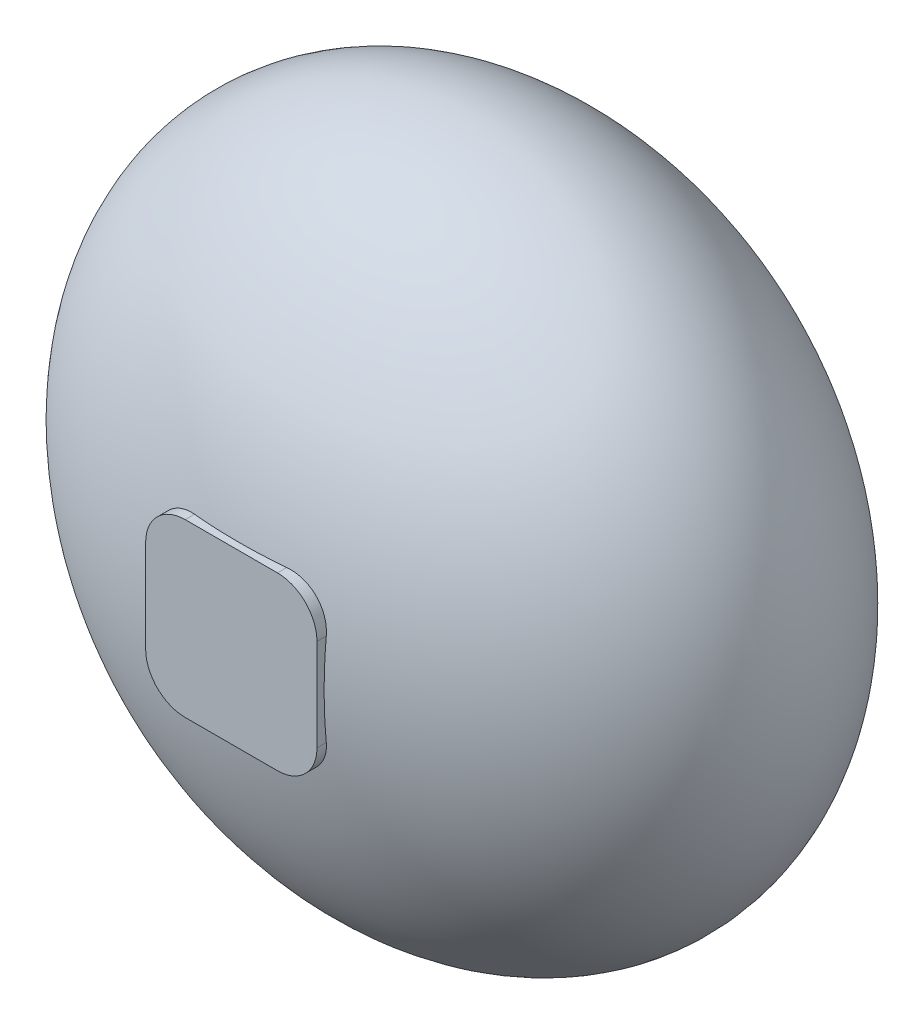
ISO-10303-21;
HEADER;
FILE_DESCRIPTION(('STEP AP214'),'2;1');
FILE_NAME('part.step','',(''),(''),'','','');
FILE_SCHEMA(('AUTOMOTIVE_DESIGN { 1 0 10303 214 1 1 1 1 }'));
ENDSEC;
DATA;
#1=APPLICATION_CONTEXT('core data for automotive mechanical design processes');
#2=APPLICATION_PROTOCOL_DEFINITION('international standard','automotive_design',2000,#1);
#3=PRODUCT_CONTEXT('',#1,'mechanical');
#4=PRODUCT('Part','Part','',(#3));
#5=PRODUCT_RELATED_PRODUCT_CATEGORY('part','',(#4));
#6=PRODUCT_DEFINITION_FORMATION('','',#4);
#7=PRODUCT_DEFINITION_CONTEXT('part definition',#1,'design');
#8=PRODUCT_DEFINITION('design','',#6,#7);
#9=PRODUCT_DEFINITION_SHAPE('','',#8);
#10=(LENGTH_UNIT() NAMED_UNIT(*) SI_UNIT(.MILLI.,.METRE.));
#11=(NAMED_UNIT(*) PLANE_ANGLE_UNIT() SI_UNIT($,.RADIAN.));
#12=(NAMED_UNIT(*) SI_UNIT($,.STERADIAN.) SOLID_ANGLE_UNIT());
#13=UNCERTAINTY_MEASURE_WITH_UNIT(LENGTH_MEASURE(1.E-05),#10,'distance_accuracy_value','');
#14=(GEOMETRIC_REPRESENTATION_CONTEXT(3) GLOBAL_UNCERTAINTY_ASSIGNED_CONTEXT((#13)) GLOBAL_UNIT_ASSIGNED_CONTEXT((#10,
#11,#12)) REPRESENTATION_CONTEXT('',''));
#15=CARTESIAN_POINT('',(0.,0.,0.));
#16=DIRECTION('',(0.,0.,1.));
#17=DIRECTION('',(1.,0.,0.));
#18=AXIS2_PLACEMENT_3D('',#15,#16,#17);
#19=CARTESIAN_POINT('',(0.,0.,0.));
#20=DIRECTION('',(0.,1.,0.));
#21=DIRECTION('',(-1.,0.,0.));
#22=AXIS2_PLACEMENT_3D('',#19,#20,#21);
#23=ELLIPSE('',#22,26.25,17.5);
#24=TRIMMED_CURVE('',#23,(PARAMETER_VALUE(1.5707963267949)),(PARAMETER_VALUE(4.71238898038469)),
.T.,.PARAMETER.);
#25=CARTESIAN_POINT('',(0.,0.,-17.5));
#26=DIRECTION('',(0.,0.,-1.));
#27=AXIS1_PLACEMENT('',#25,#26);
#28=SURFACE_OF_REVOLUTION('',#24,#27);
#29=CARTESIAN_POINT('',(0.,0.,-17.5));
#30=VERTEX_POINT('',#29);
#31=VERTEX_LOOP('',#30);
#32=FACE_BOUND('',#31,.T.);
#33=CARTESIAN_POINT('',(-6.5,6.5,16.3919017946193));
#34=CARTESIAN_POINT('',(-6.5,5.91264525642044,16.4953809386063));
#35=CARTESIAN_POINT('',(-6.5,5.32276773298897,16.5843647981933));
#36=CARTESIAN_POINT('',(-6.5,4.13942182537297,16.7337448501683));
#37=CARTESIAN_POINT('',(-6.5,3.54595357722673,16.7941421188048));
#38=CARTESIAN_POINT('',(-6.5,2.36163427938386,16.8863859319888));
#39=CARTESIAN_POINT('',(-6.5,1.77080075515783,16.9184589344479));
#40=CARTESIAN_POINT('',(-6.5,0.588282759476114,16.9550621892876));
#41=CARTESIAN_POINT('',(-6.5,-0.00340169863220947,16.9595928690712));
#42=CARTESIAN_POINT('',(-6.5,-1.08795048016656,16.9426760838968));
#43=CARTESIAN_POINT('',(-6.5,-1.58088483011511,16.9254235652404));
#44=CARTESIAN_POINT('',(-6.5,-2.56568174740475,16.8717228338387));
#45=CARTESIAN_POINT('',(-6.5,-3.05754438212753,16.8352758650471));
#46=CARTESIAN_POINT('',(-6.5,-4.04278596473044,16.7427283208595));
#47=CARTESIAN_POINT('',(-6.5,-4.53615258913905,16.6864961919658));
#48=CARTESIAN_POINT('',(-6.5,-5.52026473693784,16.5541647888713));
#49=CARTESIAN_POINT('',(-6.5,-6.01100997822129,16.478063418662));
#50=CARTESIAN_POINT('',(-6.5,-6.5,16.3919017946193));
#51=B_SPLINE_CURVE_WITH_KNOTS('',3,(#33,#34,#35,#36,#37,#38,#39,#40,#41,#42,#43,#44,#45,#46,#47,
#48,#49,#50),.UNSPECIFIED.,.F.,.F.,(4,2,2,2,2,2,2,2,4),(0.,1.78897640576976,3.57788545351683,
5.35235885285136,7.12680471576133,8.60615443752241,10.0854082974045,11.574689757719,
13.0641283860143),.UNSPECIFIED.);
#52=CARTESIAN_POINT('',(-6.49999999999999,3.50000000000234,16.7936826746777));
#53=VERTEX_POINT('',#52);
#54=CARTESIAN_POINT('',(-6.5,-3.50000000000202,16.7936826746777));
#55=VERTEX_POINT('',#54);
#56=EDGE_CURVE('E209',#53,#55,#51,.T.);
#57=ORIENTED_EDGE('',*,*,#56,.F.);
#58=CARTESIAN_POINT('',(-6.50000000000002,3.50000000000001,16.7936826746778));
#59=CARTESIAN_POINT('',(-6.50000800540084,3.58386339966856,16.7859138861007));
#60=CARTESIAN_POINT('',(-6.49648345602694,3.66775391431981,16.778464398223));
#61=CARTESIAN_POINT('',(-6.4824157644123,3.83500259933564,16.7642567511762));
#62=CARTESIAN_POINT('',(-6.47187267822471,3.91836077394636,16.7574985864864));
#63=CARTESIAN_POINT('',(-6.44382172405599,4.0839165036294,16.7447295084521));
#64=CARTESIAN_POINT('',(-6.42631748091182,4.16611463972995,16.7387182083326));
#65=CARTESIAN_POINT('',(-6.3844729513372,4.32878152790409,16.7274862214383));
#66=CARTESIAN_POINT('',(-6.3601328239601,4.40925032016815,16.7222655162728));
#67=CARTESIAN_POINT('',(-6.27702490092959,4.64731347488568,16.7078470081295));
#68=CARTESIAN_POINT('',(-6.20816368683197,4.80159918870719,16.6998901457319));
#69=CARTESIAN_POINT('',(-6.04553925582569,5.0964355541159,16.6875703906421));
#70=CARTESIAN_POINT('',(-5.95178274437025,5.2369898902732,16.6832065314841));
#71=CARTESIAN_POINT('',(-5.74248981911255,5.49982772547607,16.6782132190706));
#72=CARTESIAN_POINT('',(-5.62705922502828,5.62219502632319,16.6775660851574));
#73=CARTESIAN_POINT('',(-5.37739699713493,5.84595116267732,16.6799822276552));
#74=CARTESIAN_POINT('',(-5.24316221398295,5.94733647704101,16.6830461262519));
#75=CARTESIAN_POINT('',(-4.96005489368249,6.12606477229132,16.6927757479706));
#76=CARTESIAN_POINT('',(-4.8112121797322,6.20345544904981,16.6994342526275));
#77=CARTESIAN_POINT('',(-4.50290923054941,6.33232291752021,16.7161403139002));
#78=CARTESIAN_POINT('',(-4.3434538123607,6.38381137648715,16.7261863412466));
#79=CARTESIAN_POINT('',(-4.06930985491151,6.44772262850331,16.7457246870422));
#80=CARTESIAN_POINT('',(-3.95618128905426,6.46732247660949,16.7544112980895));
#81=CARTESIAN_POINT('',(-3.72869707686171,6.49346116193029,16.7730947027936));
#82=CARTESIAN_POINT('',(-3.61434341928388,6.50001865891717,16.7830896028053));
#83=CARTESIAN_POINT('',(-3.49999999999984,6.5,16.7936826746779));
#84=B_SPLINE_CURVE_WITH_KNOTS('',3,(#58,#59,#60,#61,#62,#63,#64,#65,#66,#67,#68,#69,#70,#71,#72,
#73,#74,#75,#76,#77,#78,#79,#80,#81,#82,#83),.UNSPECIFIED.,.F.,.F.,(4,2,2,2,2,2,2,2,2,2,2,2,4),
(0.,0.252588171974242,0.505174326691704,0.757629125761421,1.01007805134753,1.51487172308837,
2.01952956825821,2.52178472824085,3.02412410717383,3.52545845145075,4.02656677474797,
4.37128160165595,4.71550288714436),.UNSPECIFIED.);
#85=CARTESIAN_POINT('',(-3.50000000000203,6.5,16.7936826746777));
#86=VERTEX_POINT('',#85);
#87=EDGE_CURVE('E62',#53,#86,#84,.T.);
#88=ORIENTED_EDGE('',*,*,#87,.T.);
#89=CARTESIAN_POINT('',(6.5,6.5,16.3919017946193));
#90=CARTESIAN_POINT('',(5.91264525642045,6.5,16.4953809386063));
#91=CARTESIAN_POINT('',(5.32276773298898,6.5,16.5843647981933));
#92=CARTESIAN_POINT('',(4.13942182537297,6.5,16.7337448501683));
#93=CARTESIAN_POINT('',(3.54595357722673,6.5,16.7941421188048));
#94=CARTESIAN_POINT('',(2.36163427938387,6.5,16.8863859319888));
#95=CARTESIAN_POINT('',(1.77080075515783,6.5,16.9184589344479));
#96=CARTESIAN_POINT('',(0.588282759476118,6.5,16.9550621892876));
#97=CARTESIAN_POINT('',(-0.00340169863220514,6.5,16.9595928690712));
#98=CARTESIAN_POINT('',(-1.08795048016656,6.5,16.9426760838968));
#99=CARTESIAN_POINT('',(-1.5808848301151,6.5,16.9254235652404));
#100=CARTESIAN_POINT('',(-2.56568174740475,6.5,16.8717228338387));
#101=CARTESIAN_POINT('',(-3.05754438212753,6.5,16.8352758650471));
#102=CARTESIAN_POINT('',(-4.04278596473044,6.5,16.7427283208595));
#103=CARTESIAN_POINT('',(-4.53615258913904,6.5,16.6864961919659));
#104=CARTESIAN_POINT('',(-5.52026473693783,6.5,16.5541647888713));
#105=CARTESIAN_POINT('',(-6.01100997822129,6.5,16.478063418662));
#106=CARTESIAN_POINT('',(-6.5,6.5,16.3919017946193));
#107=B_SPLINE_CURVE_WITH_KNOTS('',3,(#89,#90,#91,#92,#93,#94,#95,#96,#97,#98,#99,#100,#101,#102,
#103,#104,#105,#106),.UNSPECIFIED.,.F.,.F.,(4,2,2,2,2,2,2,2,4),(0.,1.78897640576976,
3.57788545351683,5.35235885285136,7.12680471576132,8.60615443752241,10.0854082974045,
11.574689757719,13.0641283860143),.UNSPECIFIED.);
#108=CARTESIAN_POINT('',(3.50000000000234,6.50000000000001,16.7936826746777));
#109=VERTEX_POINT('',#108);
#110=EDGE_CURVE('E200',#109,#86,#107,.T.);
#111=ORIENTED_EDGE('',*,*,#110,.F.);
#112=CARTESIAN_POINT('',(3.50000000000001,6.50000000000002,16.7936826746778));
#113=CARTESIAN_POINT('',(3.58386339966856,6.50000800540084,16.7859138861007));
#114=CARTESIAN_POINT('',(3.66775391431981,6.49648345602694,16.778464398223));
#115=CARTESIAN_POINT('',(3.83500259933564,6.4824157644123,16.7642567511762));
#116=CARTESIAN_POINT('',(3.91836077394636,6.47187267822471,16.7574985864864));
#117=CARTESIAN_POINT('',(4.0839165036294,6.44382172405599,16.7447295084521));
#118=CARTESIAN_POINT('',(4.16611463972995,6.42631748091182,16.7387182083326));
#119=CARTESIAN_POINT('',(4.32878152790409,6.3844729513372,16.7274862214383));
#120=CARTESIAN_POINT('',(4.40925032016815,6.36013282396011,16.7222655162728));
#121=CARTESIAN_POINT('',(4.64731347488568,6.27702490092959,16.7078470081295));
#122=CARTESIAN_POINT('',(4.80159918870719,6.20816368683198,16.6998901457319));
#123=CARTESIAN_POINT('',(5.09643555411589,6.0455392558257,16.6875703906421));
#124=CARTESIAN_POINT('',(5.2369898902732,5.95178274437025,16.6832065314841));
#125=CARTESIAN_POINT('',(5.49982772547606,5.74248981911255,16.6782132190706));
#126=CARTESIAN_POINT('',(5.62219502632319,5.62705922502828,16.6775660851574));
#127=CARTESIAN_POINT('',(5.84595116267732,5.37739699713493,16.6799822276552));
#128=CARTESIAN_POINT('',(5.94733647704101,5.24316221398295,16.6830461262519));
#129=CARTESIAN_POINT('',(6.12606477229131,4.96005489368249,16.6927757479706));
#130=CARTESIAN_POINT('',(6.20345544904981,4.8112121797322,16.6994342526275));
#131=CARTESIAN_POINT('',(6.33232291752021,4.50290923054942,16.7161403139002));
#132=CARTESIAN_POINT('',(6.38381137648715,4.34345381236071,16.7261863412466));
#133=CARTESIAN_POINT('',(6.44772262850331,4.06930985491152,16.7457246870422));
#134=CARTESIAN_POINT('',(6.46732247660949,3.95618128905427,16.7544112980895));
#135=CARTESIAN_POINT('',(6.49346116193028,3.72869707686171,16.7730947027936));
#136=CARTESIAN_POINT('',(6.50001865891717,3.61434341928388,16.7830896028053));
#137=CARTESIAN_POINT('',(6.5,3.49999999999984,16.7936826746779));
#138=B_SPLINE_CURVE_WITH_KNOTS('',3,(#112,#113,#114,#115,#116,#117,#118,#119,#120,#121,#122,
#123,#124,#125,#126,#127,#128,#129,#130,#131,#132,#133,#134,#135,#136,#137),.UNSPECIFIED.,.F.,
.F.,(4,2,2,2,2,2,2,2,2,2,2,2,4),(0.,0.252588171974242,0.505174326691704,0.75762912576142,
1.01007805134753,1.51487172308837,2.01952956825821,2.52178472824086,3.02412410717383,
3.52545845145075,4.02656677474797,4.37128160165595,4.71550288714436),.UNSPECIFIED.);
#139=CARTESIAN_POINT('',(6.5,3.50000000000202,16.7936826746777));
#140=VERTEX_POINT('',#139);
#141=EDGE_CURVE('E55',#109,#140,#138,.T.);
#142=ORIENTED_EDGE('',*,*,#141,.T.);
#143=CARTESIAN_POINT('',(6.5,-6.5,16.3919017946193));
#144=CARTESIAN_POINT('',(6.5,-5.91264525642044,16.4953809386063));
#145=CARTESIAN_POINT('',(6.5,-5.32276773298897,16.5843647981933));
#146=CARTESIAN_POINT('',(6.5,-4.13942182537297,16.7337448501683));
#147=CARTESIAN_POINT('',(6.5,-3.54595357722673,16.7941421188048));
#148=CARTESIAN_POINT('',(6.5,-2.36163427938386,16.8863859319888));
#149=CARTESIAN_POINT('',(6.5,-1.77080075515783,16.9184589344479));
#150=CARTESIAN_POINT('',(6.5,-0.588282759476115,16.9550621892876));
#151=CARTESIAN_POINT('',(6.5,0.00340169863220861,16.9595928690712));
#152=CARTESIAN_POINT('',(6.5,1.08795048016656,16.9426760838968));
#153=CARTESIAN_POINT('',(6.5,1.58088483011511,16.9254235652404));
#154=CARTESIAN_POINT('',(6.5,2.56568174740476,16.8717228338387));
#155=CARTESIAN_POINT('',(6.5,3.05754438212753,16.8352758650471));
#156=CARTESIAN_POINT('',(6.5,4.04278596473044,16.7427283208595));
#157=CARTESIAN_POINT('',(6.5,4.53615258913905,16.6864961919658));
#158=CARTESIAN_POINT('',(6.5,5.52026473693784,16.5541647888713));
#159=CARTESIAN_POINT('',(6.5,6.0110099782213,16.478063418662));
#160=CARTESIAN_POINT('',(6.5,6.50000000000001,16.3919017946193));
#161=B_SPLINE_CURVE_WITH_KNOTS('',3,(#143,#144,#145,#146,#147,#148,#149,#150,#151,#152,#153,
#154,#155,#156,#157,#158,#159,#160),.UNSPECIFIED.,.F.,.F.,(4,2,2,2,2,2,2,2,4),(0.,
1.78897640576976,3.57788545351683,5.35235885285136,7.12680471576132,8.60615443752241,
10.0854082974045,11.574689757719,13.0641283860143),.UNSPECIFIED.);
#162=CARTESIAN_POINT('',(6.5,-3.50000000000233,16.7936826746777));
#163=VERTEX_POINT('',#162);
#164=EDGE_CURVE('E199',#163,#140,#161,.T.);
#165=ORIENTED_EDGE('',*,*,#164,.F.);
#166=CARTESIAN_POINT('',(6.50000000000002,-3.50000000000001,16.7936826746778));
#167=CARTESIAN_POINT('',(6.50000800540084,-3.58386339966855,16.7859138861007));
#168=CARTESIAN_POINT('',(6.49648345602694,-3.6677539143198,16.778464398223));
#169=CARTESIAN_POINT('',(6.4824157644123,-3.83500259933564,16.7642567511762));
#170=CARTESIAN_POINT('',(6.47187267822471,-3.91836077394636,16.7574985864864));
#171=CARTESIAN_POINT('',(6.44382172405599,-4.0839165036294,16.7447295084521));
#172=CARTESIAN_POINT('',(6.42631748091182,-4.16611463972995,16.7387182083326));
#173=CARTESIAN_POINT('',(6.3844729513372,-4.32878152790409,16.7274862214383));
#174=CARTESIAN_POINT('',(6.3601328239601,-4.40925032016815,16.7222655162728));
#175=CARTESIAN_POINT('',(6.27702490092959,-4.64731347488568,16.7078470081295));
#176=CARTESIAN_POINT('',(6.20816368683197,-4.80159918870719,16.6998901457319));
#177=CARTESIAN_POINT('',(6.04553925582569,-5.09643555411589,16.6875703906421));
#178=CARTESIAN_POINT('',(5.95178274437024,-5.2369898902732,16.6832065314841));
#179=CARTESIAN_POINT('',(5.74248981911255,-5.49982772547607,16.6782132190706));
#180=CARTESIAN_POINT('',(5.62705922502827,-5.62219502632319,16.6775660851574));
#181=CARTESIAN_POINT('',(5.37739699713492,-5.84595116267732,16.6799822276552));
#182=CARTESIAN_POINT('',(5.24316221398294,-5.94733647704101,16.6830461262519));
#183=CARTESIAN_POINT('',(4.96005489368249,-6.12606477229131,16.6927757479706));
#184=CARTESIAN_POINT('',(4.8112121797322,-6.20345544904981,16.6994342526275));
#185=CARTESIAN_POINT('',(4.50290923054941,-6.33232291752021,16.7161403139002));
#186=CARTESIAN_POINT('',(4.3434538123607,-6.38381137648715,16.7261863412466));
#187=CARTESIAN_POINT('',(4.06930985491151,-6.4477226285033,16.7457246870422));
#188=CARTESIAN_POINT('',(3.95618128905426,-6.46732247660949,16.7544112980895));
#189=CARTESIAN_POINT('',(3.7286970768617,-6.49346116193028,16.7730947027936));
#190=CARTESIAN_POINT('',(3.61434341928388,-6.50001865891716,16.7830896028053));
#191=CARTESIAN_POINT('',(3.49999999999984,-6.5,16.7936826746779));
#192=B_SPLINE_CURVE_WITH_KNOTS('',3,(#166,#167,#168,#169,#170,#171,#172,#173,#174,#175,#176,
#177,#178,#179,#180,#181,#182,#183,#184,#185,#186,#187,#188,#189,#190,#191),.UNSPECIFIED.,.F.,
.F.,(4,2,2,2,2,2,2,2,2,2,2,2,4),(0.,0.252588171974243,0.505174326691706,0.757629125761424,
1.01007805134753,1.51487172308838,2.01952956825822,2.52178472824086,3.02412410717383,
3.52545845145075,4.02656677474797,4.37128160165595,4.71550288714436),.UNSPECIFIED.);
#193=CARTESIAN_POINT('',(3.50000000000202,-6.5,16.7936826746777));
#194=VERTEX_POINT('',#193);
#195=EDGE_CURVE('E166',#163,#194,#192,.T.);
#196=ORIENTED_EDGE('',*,*,#195,.T.);
#197=CARTESIAN_POINT('',(-6.5,-6.5,16.3919017946193));
#198=CARTESIAN_POINT('',(-5.91264525642045,-6.5,16.4953809386063));
#199=CARTESIAN_POINT('',(-5.32276773298897,-6.5,16.5843647981933));
#200=CARTESIAN_POINT('',(-4.13942182537297,-6.5,16.7337448501683));
#201=CARTESIAN_POINT('',(-3.54595357722673,-6.5,16.7941421188048));
#202=CARTESIAN_POINT('',(-2.36163427938387,-6.5,16.8863859319888));
#203=CARTESIAN_POINT('',(-1.77080075515783,-6.5,16.9184589344479));
#204=CARTESIAN_POINT('',(-0.588282759476118,-6.5,16.9550621892876));
#205=CARTESIAN_POINT('',(0.00340169863220535,-6.5,16.9595928690712));
#206=CARTESIAN_POINT('',(1.08795048016656,-6.5,16.9426760838968));
#207=CARTESIAN_POINT('',(1.5808848301151,-6.5,16.9254235652404));
#208=CARTESIAN_POINT('',(2.56568174740475,-6.5,16.8717228338387));
#209=CARTESIAN_POINT('',(3.05754438212753,-6.5,16.8352758650471));
#210=CARTESIAN_POINT('',(4.04278596473044,-6.5,16.7427283208595));
#211=CARTESIAN_POINT('',(4.53615258913905,-6.5,16.6864961919658));
#212=CARTESIAN_POINT('',(5.52026473693784,-6.5,16.5541647888713));
#213=CARTESIAN_POINT('',(6.0110099782213,-6.5,16.478063418662));
#214=CARTESIAN_POINT('',(6.5,-6.5,16.3919017946193));
#215=B_SPLINE_CURVE_WITH_KNOTS('',3,(#197,#198,#199,#200,#201,#202,#203,#204,#205,#206,#207,
#208,#209,#210,#211,#212,#213,#214),.UNSPECIFIED.,.F.,.F.,(4,2,2,2,2,2,2,2,4),(0.,
1.78897640576976,3.57788545351683,5.35235885285136,7.12680471576132,8.60615443752241,
10.0854082974045,11.574689757719,13.0641283860143),.UNSPECIFIED.);
#216=CARTESIAN_POINT('',(-3.50000000000234,-6.49999999999999,16.7936826746777));
#217=VERTEX_POINT('',#216);
#218=EDGE_CURVE('E205',#217,#194,#215,.T.);
#219=ORIENTED_EDGE('',*,*,#218,.F.);
#220=CARTESIAN_POINT('',(-3.50000000000001,-6.50000000000002,16.7936826746778));
#221=CARTESIAN_POINT('',(-3.58386339966855,-6.50000800540084,16.7859138861007));
#222=CARTESIAN_POINT('',(-3.66775391431981,-6.49648345602694,16.778464398223));
#223=CARTESIAN_POINT('',(-3.83500259933564,-6.4824157644123,16.7642567511762));
#224=CARTESIAN_POINT('',(-3.91836077394636,-6.47187267822471,16.7574985864864));
#225=CARTESIAN_POINT('',(-4.0839165036294,-6.44382172405599,16.7447295084521));
#226=CARTESIAN_POINT('',(-4.16611463972995,-6.42631748091181,16.7387182083326));
#227=CARTESIAN_POINT('',(-4.32878152790409,-6.3844729513372,16.7274862214383));
#228=CARTESIAN_POINT('',(-4.40925032016815,-6.3601328239601,16.7222655162728));
#229=CARTESIAN_POINT('',(-4.64731347488568,-6.27702490092959,16.7078470081295));
#230=CARTESIAN_POINT('',(-4.80159918870719,-6.20816368683197,16.6998901457319));
#231=CARTESIAN_POINT('',(-5.09643555411589,-6.04553925582569,16.6875703906421));
#232=CARTESIAN_POINT('',(-5.2369898902732,-5.95178274437024,16.6832065314841));
#233=CARTESIAN_POINT('',(-5.49982772547606,-5.74248981911255,16.6782132190706));
#234=CARTESIAN_POINT('',(-5.62219502632319,-5.62705922502827,16.6775660851574));
#235=CARTESIAN_POINT('',(-5.84595116267732,-5.37739699713492,16.6799822276552));
#236=CARTESIAN_POINT('',(-5.94733647704101,-5.24316221398295,16.6830461262519));
#237=CARTESIAN_POINT('',(-6.12606477229132,-4.9600548936825,16.6927757479706));
#238=CARTESIAN_POINT('',(-6.20345544904981,-4.8112121797322,16.6994342526275));
#239=CARTESIAN_POINT('',(-6.33232291752021,-4.50290923054941,16.7161403139002));
#240=CARTESIAN_POINT('',(-6.38381137648715,-4.34345381236071,16.7261863412466));
#241=CARTESIAN_POINT('',(-6.4477226285033,-4.06930985491151,16.7457246870423));
#242=CARTESIAN_POINT('',(-6.46732247660949,-3.95618128905426,16.7544112980895));
#243=CARTESIAN_POINT('',(-6.49346116193029,-3.7286970768617,16.7730947027936));
#244=CARTESIAN_POINT('',(-6.50001865891717,-3.61434341928388,16.7830896028053));
#245=CARTESIAN_POINT('',(-6.5,-3.49999999999983,16.7936826746779));
#246=B_SPLINE_CURVE_WITH_KNOTS('',3,(#220,#221,#222,#223,#224,#225,#226,#227,#228,#229,#230,
#231,#232,#233,#234,#235,#236,#237,#238,#239,#240,#241,#242,#243,#244,#245),.UNSPECIFIED.,.F.,
.F.,(4,2,2,2,2,2,2,2,2,2,2,2,4),(0.,0.252588171974243,0.505174326691705,0.757629125761422,
1.01007805134753,1.51487172308837,2.01952956825821,2.52178472824085,3.02412410717383,
3.52545845145075,4.02656677474796,4.37128160165595,4.71550288714436),.UNSPECIFIED.);
#247=EDGE_CURVE('E11',#217,#55,#246,.T.);
#248=ORIENTED_EDGE('',*,*,#247,.T.);
#249=EDGE_LOOP('',(#57,#88,#111,#142,#165,#196,#219,#248));
#250=FACE_BOUND('',#249,.T.);
#251=ADVANCED_FACE('F40',(#32,#250),#28,.T.);
#252=CARTESIAN_POINT('',(-6.5,-6.5,17.5));
#253=DIRECTION('',(1.,0.,0.));
#254=DIRECTION('',(0.,0.,-1.));
#255=AXIS2_PLACEMENT_3D('',#252,#253,#254);
#256=PLANE('',#255);
#257=DIRECTION('',(0.,-1.,0.));
#258=VECTOR('',#257,1.);
#259=CARTESIAN_POINT('',(-6.5,-6.5,17.5));
#260=LINE('',#259,#258);
#261=CARTESIAN_POINT('',(-6.5,3.5,17.5));
#262=VERTEX_POINT('',#261);
#263=CARTESIAN_POINT('',(-6.5,-3.5,17.5));
#264=VERTEX_POINT('',#263);
#265=EDGE_CURVE('E137',#262,#264,#260,.T.);
#266=ORIENTED_EDGE('',*,*,#265,.F.);
#267=DIRECTION('',(0.,0.,-1.));
#268=VECTOR('',#267,1.);
#269=CARTESIAN_POINT('',(-6.5,3.5,17.5));
#270=LINE('',#269,#268);
#271=EDGE_CURVE('E151',#262,#53,#270,.T.);
#272=ORIENTED_EDGE('',*,*,#271,.T.);
#273=ORIENTED_EDGE('',*,*,#56,.T.);
#274=DIRECTION('',(0.,0.,-1.));
#275=VECTOR('',#274,1.);
#276=CARTESIAN_POINT('',(-6.5,-3.5,17.5));
#277=LINE('',#276,#275);
#278=EDGE_CURVE('E146',#55,#264,#277,.F.);
#279=ORIENTED_EDGE('',*,*,#278,.T.);
#280=EDGE_LOOP('',(#266,#272,#273,#279));
#281=FACE_BOUND('',#280,.T.);
#282=ADVANCED_FACE('F261',(#281),#256,.F.);
#283=CARTESIAN_POINT('',(6.5,-6.5,17.5));
#284=DIRECTION('',(0.,1.,0.));
#285=DIRECTION('',(-1.,0.,0.));
#286=AXIS2_PLACEMENT_3D('',#283,#284,#285);
#287=PLANE('',#286);
#288=ORIENTED_EDGE('',*,*,#218,.T.);
#289=DIRECTION('',(0.,0.,-1.));
#290=VECTOR('',#289,1.);
#291=CARTESIAN_POINT('',(3.5,-6.5,17.5));
#292=LINE('',#291,#290);
#293=CARTESIAN_POINT('',(3.5,-6.5,17.5));
#294=VERTEX_POINT('',#293);
#295=EDGE_CURVE('E142',#194,#294,#292,.F.);
#296=ORIENTED_EDGE('',*,*,#295,.T.);
#297=DIRECTION('',(1.,0.,0.));
#298=VECTOR('',#297,1.);
#299=CARTESIAN_POINT('',(6.5,-6.5,17.5));
#300=LINE('',#299,#298);
#301=CARTESIAN_POINT('',(-3.5,-6.5,17.5));
#302=VERTEX_POINT('',#301);
#303=EDGE_CURVE('E124',#302,#294,#300,.T.);
#304=ORIENTED_EDGE('',*,*,#303,.F.);
#305=DIRECTION('',(0.,0.,-1.));
#306=VECTOR('',#305,1.);
#307=CARTESIAN_POINT('',(-3.5,-6.5,17.5));
#308=LINE('',#307,#306);
#309=EDGE_CURVE('E213',#302,#217,#308,.T.);
#310=ORIENTED_EDGE('',*,*,#309,.T.);
#311=EDGE_LOOP('',(#288,#296,#304,#310));
#312=FACE_BOUND('',#311,.T.);
#313=ADVANCED_FACE('F258',(#312),#287,.F.);
#314=CARTESIAN_POINT('',(6.5,-6.5,17.5));
#315=DIRECTION('',(-1.,0.,0.));
#316=DIRECTION('',(0.,0.,1.));
#317=AXIS2_PLACEMENT_3D('',#314,#315,#316);
#318=PLANE('',#317);
#319=DIRECTION('',(0.,1.,0.));
#320=VECTOR('',#319,1.);
#321=CARTESIAN_POINT('',(6.5,-6.5,17.5));
#322=LINE('',#321,#320);
#323=CARTESIAN_POINT('',(6.5,-3.5,17.5));
#324=VERTEX_POINT('',#323);
#325=CARTESIAN_POINT('',(6.5,3.5,17.5));
#326=VERTEX_POINT('',#325);
#327=EDGE_CURVE('E136',#324,#326,#322,.T.);
#328=ORIENTED_EDGE('',*,*,#327,.F.);
#329=DIRECTION('',(0.,0.,-1.));
#330=VECTOR('',#329,1.);
#331=CARTESIAN_POINT('',(6.5,-3.5,17.5));
#332=LINE('',#331,#330);
#333=EDGE_CURVE('E144',#324,#163,#332,.T.);
#334=ORIENTED_EDGE('',*,*,#333,.T.);
#335=ORIENTED_EDGE('',*,*,#164,.T.);
#336=DIRECTION('',(0.,0.,-1.));
#337=VECTOR('',#336,1.);
#338=CARTESIAN_POINT('',(6.5,3.5,17.5));
#339=LINE('',#338,#337);
#340=EDGE_CURVE('E203',#140,#326,#339,.F.);
#341=ORIENTED_EDGE('',*,*,#340,.T.);
#342=EDGE_LOOP('',(#328,#334,#335,#341));
#343=FACE_BOUND('',#342,.T.);
#344=ADVANCED_FACE('F202',(#343),#318,.F.);
#345=CARTESIAN_POINT('',(6.5,6.5,17.5));
#346=DIRECTION('',(0.,-1.,0.));
#347=DIRECTION('',(1.,0.,0.));
#348=AXIS2_PLACEMENT_3D('',#345,#346,#347);
#349=PLANE('',#348);
#350=ORIENTED_EDGE('',*,*,#110,.T.);
#351=DIRECTION('',(0.,0.,-1.));
#352=VECTOR('',#351,1.);
#353=CARTESIAN_POINT('',(-3.5,6.5,17.5));
#354=LINE('',#353,#352);
#355=CARTESIAN_POINT('',(-3.5,6.5,17.5));
#356=VERTEX_POINT('',#355);
#357=EDGE_CURVE('E163',#86,#356,#354,.F.);
#358=ORIENTED_EDGE('',*,*,#357,.T.);
#359=DIRECTION('',(-1.,0.,0.));
#360=VECTOR('',#359,1.);
#361=CARTESIAN_POINT('',(6.5,6.5,17.5));
#362=LINE('',#361,#360);
#363=CARTESIAN_POINT('',(3.5,6.5,17.5));
#364=VERTEX_POINT('',#363);
#365=EDGE_CURVE('E231',#364,#356,#362,.T.);
#366=ORIENTED_EDGE('',*,*,#365,.F.);
#367=DIRECTION('',(0.,0.,-1.));
#368=VECTOR('',#367,1.);
#369=CARTESIAN_POINT('',(3.5,6.5,17.5));
#370=LINE('',#369,#368);
#371=EDGE_CURVE('E160',#364,#109,#370,.T.);
#372=ORIENTED_EDGE('',*,*,#371,.T.);
#373=EDGE_LOOP('',(#350,#358,#366,#372));
#374=FACE_BOUND('',#373,.T.);
#375=ADVANCED_FACE('F120',(#374),#349,.F.);
#376=CARTESIAN_POINT('',(0.,0.,17.5));
#377=DIRECTION('',(0.,0.,1.));
#378=DIRECTION('',(1.,0.,0.));
#379=AXIS2_PLACEMENT_3D('',#376,#377,#378);
#380=PLANE('',#379);
#381=CARTESIAN_POINT('',(0.,0.,17.5));
#382=VERTEX_POINT('',#381);
#383=VERTEX_LOOP('',#382);
#384=FACE_BOUND('',#383,.T.);
#385=ORIENTED_EDGE('',*,*,#303,.T.);
#386=CARTESIAN_POINT('',(3.5,-3.5,17.5));
#387=DIRECTION('',(0.,0.,1.));
#388=DIRECTION('',(1.,0.,0.));
#389=AXIS2_PLACEMENT_3D('',#386,#387,#388);
#390=CIRCLE('',#389,3.);
#391=EDGE_CURVE('E127',#294,#324,#390,.T.);
#392=ORIENTED_EDGE('',*,*,#391,.T.);
#393=ORIENTED_EDGE('',*,*,#327,.T.);
#394=CARTESIAN_POINT('',(3.5,3.5,17.5));
#395=DIRECTION('',(0.,0.,1.));
#396=DIRECTION('',(1.,0.,0.));
#397=AXIS2_PLACEMENT_3D('',#394,#395,#396);
#398=CIRCLE('',#397,3.);
#399=EDGE_CURVE('E153',#326,#364,#398,.T.);
#400=ORIENTED_EDGE('',*,*,#399,.T.);
#401=ORIENTED_EDGE('',*,*,#365,.T.);
#402=CARTESIAN_POINT('',(-3.5,3.5,17.5));
#403=DIRECTION('',(0.,0.,1.));
#404=DIRECTION('',(1.,0.,0.));
#405=AXIS2_PLACEMENT_3D('',#402,#403,#404);
#406=CIRCLE('',#405,3.);
#407=EDGE_CURVE('E147',#356,#262,#406,.T.);
#408=ORIENTED_EDGE('',*,*,#407,.T.);
#409=ORIENTED_EDGE('',*,*,#265,.T.);
#410=CARTESIAN_POINT('',(-3.5,-3.5,17.5));
#411=DIRECTION('',(0.,0.,1.));
#412=DIRECTION('',(1.,0.,0.));
#413=AXIS2_PLACEMENT_3D('',#410,#411,#412);
#414=CIRCLE('',#413,3.);
#415=EDGE_CURVE('E131',#264,#302,#414,.T.);
#416=ORIENTED_EDGE('',*,*,#415,.T.);
#417=EDGE_LOOP('',(#385,#392,#393,#400,#401,#408,#409,#416));
#418=FACE_BOUND('',#417,.T.);
#419=ADVANCED_FACE('F116',(#384,#418),#380,.T.);
#420=CARTESIAN_POINT('',(3.5,-3.5,17.5));
#421=DIRECTION('',(0.,0.,-1.));
#422=DIRECTION('',(-1.,0.,0.));
#423=AXIS2_PLACEMENT_3D('',#420,#421,#422);
#424=CYLINDRICAL_SURFACE('',#423,3.);
#425=ORIENTED_EDGE('',*,*,#391,.F.);
#426=ORIENTED_EDGE('',*,*,#295,.F.);
#427=ORIENTED_EDGE('',*,*,#195,.F.);
#428=ORIENTED_EDGE('',*,*,#333,.F.);
#429=EDGE_LOOP('',(#425,#426,#427,#428));
#430=FACE_BOUND('',#429,.T.);
#431=ADVANCED_FACE('F119',(#430),#424,.T.);
#432=CARTESIAN_POINT('',(-3.5,3.5,17.5));
#433=DIRECTION('',(0.,0.,-1.));
#434=DIRECTION('',(-1.,0.,0.));
#435=AXIS2_PLACEMENT_3D('',#432,#433,#434);
#436=CYLINDRICAL_SURFACE('',#435,3.);
#437=ORIENTED_EDGE('',*,*,#407,.F.);
#438=ORIENTED_EDGE('',*,*,#357,.F.);
#439=ORIENTED_EDGE('',*,*,#87,.F.);
#440=ORIENTED_EDGE('',*,*,#271,.F.);
#441=EDGE_LOOP('',(#437,#438,#439,#440));
#442=FACE_BOUND('',#441,.T.);
#443=ADVANCED_FACE('F184',(#442),#436,.T.);
#444=CARTESIAN_POINT('',(3.5,3.5,17.5));
#445=DIRECTION('',(0.,0.,-1.));
#446=DIRECTION('',(-1.,0.,0.));
#447=AXIS2_PLACEMENT_3D('',#444,#445,#446);
#448=CYLINDRICAL_SURFACE('',#447,3.);
#449=ORIENTED_EDGE('',*,*,#399,.F.);
#450=ORIENTED_EDGE('',*,*,#340,.F.);
#451=ORIENTED_EDGE('',*,*,#141,.F.);
#452=ORIENTED_EDGE('',*,*,#371,.F.);
#453=EDGE_LOOP('',(#449,#450,#451,#452));
#454=FACE_BOUND('',#453,.T.);
#455=ADVANCED_FACE('F187',(#454),#448,.T.);
#456=CARTESIAN_POINT('',(-3.5,-3.5,17.5));
#457=DIRECTION('',(0.,0.,-1.));
#458=DIRECTION('',(-1.,0.,0.));
#459=AXIS2_PLACEMENT_3D('',#456,#457,#458);
#460=CYLINDRICAL_SURFACE('',#459,3.);
#461=ORIENTED_EDGE('',*,*,#415,.F.);
#462=ORIENTED_EDGE('',*,*,#278,.F.);
#463=ORIENTED_EDGE('',*,*,#247,.F.);
#464=ORIENTED_EDGE('',*,*,#309,.F.);
#465=EDGE_LOOP('',(#461,#462,#463,#464));
#466=FACE_BOUND('',#465,.T.);
#467=ADVANCED_FACE('F42',(#466),#460,.T.);
#468=CLOSED_SHELL('',(#251,#282,#313,#344,#375,#419,#431,#443,#455,#467));
#469=CARTESIAN_POINT('',(0.,0.,13.));
#470=DIRECTION('',(0.,0.,-1.));
#471=DIRECTION('',(-1.,0.,0.));
#472=AXIS2_PLACEMENT_3D('',#469,#470,#471);
#473=CYLINDRICAL_SURFACE('',#472,7.);
#474=CARTESIAN_POINT('',(0.,0.,13.));
#475=DIRECTION('',(0.,0.,1.));
#476=DIRECTION('',(1.,0.,0.));
#477=AXIS2_PLACEMENT_3D('',#474,#475,#476);
#478=CIRCLE('',#477,7.);
#479=CARTESIAN_POINT('',(7.,0.,13.));
#480=VERTEX_POINT('',#479);
#481=EDGE_CURVE('E357',#480,#480,#478,.T.);
#482=ORIENTED_EDGE('',*,*,#481,.T.);
#483=EDGE_LOOP('',(#482));
#484=FACE_BOUND('',#483,.T.);
#485=CARTESIAN_POINT('',(0.,0.,0.));
#486=DIRECTION('',(0.,0.,1.));
#487=DIRECTION('',(1.,0.,0.));
#488=AXIS2_PLACEMENT_3D('',#485,#486,#487);
#489=CIRCLE('',#488,7.);
#490=CARTESIAN_POINT('',(7.,0.,0.));
#491=VERTEX_POINT('',#490);
#492=EDGE_CURVE('E354',#491,#491,#489,.T.);
#493=ORIENTED_EDGE('',*,*,#492,.F.);
#494=EDGE_LOOP('',(#493));
#495=FACE_BOUND('',#494,.T.);
#496=ADVANCED_FACE('F324',(#484,#495),#473,.F.);
#497=CARTESIAN_POINT('',(0.,0.,13.));
#498=DIRECTION('',(0.,0.,1.));
#499=DIRECTION('',(1.,0.,0.));
#500=AXIS2_PLACEMENT_3D('',#497,#498,#499);
#501=PLANE('',#500);
#502=ORIENTED_EDGE('',*,*,#481,.F.);
#503=EDGE_LOOP('',(#502));
#504=FACE_BOUND('',#503,.T.);
#505=ADVANCED_FACE('F327',(#504),#501,.F.);
#506=CARTESIAN_POINT('',(0.,0.,0.));
#507=DIRECTION('',(0.,0.,1.));
#508=DIRECTION('',(1.,0.,0.));
#509=AXIS2_PLACEMENT_3D('',#506,#507,#508);
#510=PLANE('',#509);
#511=ORIENTED_EDGE('',*,*,#492,.T.);
#512=EDGE_LOOP('',(#511));
#513=FACE_BOUND('',#512,.T.);
#514=ADVANCED_FACE('F337',(#513),#510,.T.);
#515=CLOSED_SHELL('',(#496,#505,#514));
#516=ORIENTED_CLOSED_SHELL('',*,#515,.T.);
#517=BREP_WITH_VOIDS('B2',#468,(#516));
#518=ADVANCED_BREP_SHAPE_REPRESENTATION('',(#18,#517),#14);
#519=SHAPE_DEFINITION_REPRESENTATION(#9,#518);
ENDSEC;
END-ISO-10303-21;
